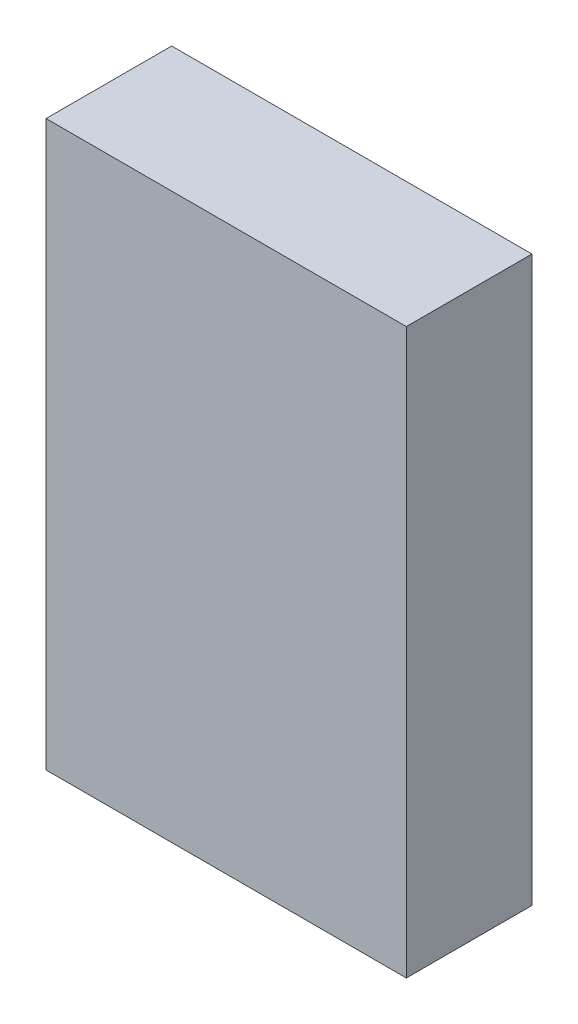
ISO-10303-21;
HEADER;
FILE_DESCRIPTION(('STEP AP214'),'2;1');
FILE_NAME('part.step','',(''),(''),'','','');
FILE_SCHEMA(('AUTOMOTIVE_DESIGN { 1 0 10303 214 1 1 1 1 }'));
ENDSEC;
DATA;
#1=APPLICATION_CONTEXT('core data for automotive mechanical design processes');
#2=APPLICATION_PROTOCOL_DEFINITION('international standard','automotive_design',2000,#1);
#3=PRODUCT_CONTEXT('',#1,'mechanical');
#4=PRODUCT('Part','Part','',(#3));
#5=PRODUCT_RELATED_PRODUCT_CATEGORY('part','',(#4));
#6=PRODUCT_DEFINITION_FORMATION('','',#4);
#7=PRODUCT_DEFINITION_CONTEXT('part definition',#1,'design');
#8=PRODUCT_DEFINITION('design','',#6,#7);
#9=PRODUCT_DEFINITION_SHAPE('','',#8);
#10=(LENGTH_UNIT() NAMED_UNIT(*) SI_UNIT(.MILLI.,.METRE.));
#11=(NAMED_UNIT(*) PLANE_ANGLE_UNIT() SI_UNIT($,.RADIAN.));
#12=(NAMED_UNIT(*) SI_UNIT($,.STERADIAN.) SOLID_ANGLE_UNIT());
#13=UNCERTAINTY_MEASURE_WITH_UNIT(LENGTH_MEASURE(1.E-05),#10,'distance_accuracy_value','');
#14=(GEOMETRIC_REPRESENTATION_CONTEXT(3) GLOBAL_UNCERTAINTY_ASSIGNED_CONTEXT((#13)) GLOBAL_UNIT_ASSIGNED_CONTEXT((#10,
#11,#12)) REPRESENTATION_CONTEXT('',''));
#15=CARTESIAN_POINT('',(0.,0.,0.));
#16=DIRECTION('',(0.,0.,1.));
#17=DIRECTION('',(1.,0.,0.));
#18=AXIS2_PLACEMENT_3D('',#15,#16,#17);
#19=CARTESIAN_POINT('',(3.80000002,5.9500008,2.64999978));
#20=DIRECTION('',(0.,0.,-1.));
#21=DIRECTION('',(-1.,0.,0.));
#22=AXIS2_PLACEMENT_3D('',#19,#20,#21);
#23=PLANE('',#22);
#24=DIRECTION('',(0.,1.,0.));
#25=VECTOR('',#24,1.);
#26=CARTESIAN_POINT('',(-3.80000002,5.9500008,2.64999978));
#27=LINE('',#26,#25);
#28=CARTESIAN_POINT('',(-3.80000002,5.9500008,2.64999978));
#29=VERTEX_POINT('',#28);
#30=CARTESIAN_POINT('',(-3.80000002,-5.9500008,2.64999978));
#31=VERTEX_POINT('',#30);
#32=EDGE_CURVE('E55',#29,#31,#27,.F.);
#33=ORIENTED_EDGE('',*,*,#32,.T.);
#34=DIRECTION('',(1.,0.,0.));
#35=VECTOR('',#34,1.);
#36=CARTESIAN_POINT('',(-3.80000002,-5.9500008,2.64999978));
#37=LINE('',#36,#35);
#38=CARTESIAN_POINT('',(3.80000002,-5.9500008,2.64999978));
#39=VERTEX_POINT('',#38);
#40=EDGE_CURVE('E57',#31,#39,#37,.T.);
#41=ORIENTED_EDGE('',*,*,#40,.T.);
#42=DIRECTION('',(0.,1.,0.));
#43=VECTOR('',#42,1.);
#44=CARTESIAN_POINT('',(3.80000002,-5.9500008,2.64999978));
#45=LINE('',#44,#43);
#46=CARTESIAN_POINT('',(3.80000002,5.9500008,2.64999978));
#47=VERTEX_POINT('',#46);
#48=EDGE_CURVE('E20',#39,#47,#45,.T.);
#49=ORIENTED_EDGE('',*,*,#48,.T.);
#50=DIRECTION('',(1.,0.,0.));
#51=VECTOR('',#50,1.);
#52=CARTESIAN_POINT('',(3.80000002,5.9500008,2.64999978));
#53=LINE('',#52,#51);
#54=EDGE_CURVE('E80',#47,#29,#53,.F.);
#55=ORIENTED_EDGE('',*,*,#54,.T.);
#56=EDGE_LOOP('',(#33,#41,#49,#55));
#57=FACE_BOUND('',#56,.T.);
#58=ADVANCED_FACE('F17',(#57),#23,.F.);
#59=CARTESIAN_POINT('',(3.80000002,-5.9500008,0.));
#60=DIRECTION('',(-1.,0.,0.));
#61=DIRECTION('',(0.,0.,1.));
#62=AXIS2_PLACEMENT_3D('',#59,#60,#61);
#63=PLANE('',#62);
#64=DIRECTION('',(0.,0.,-1.));
#65=VECTOR('',#64,1.);
#66=CARTESIAN_POINT('',(3.80000002,5.9500008,0.));
#67=LINE('',#66,#65);
#68=CARTESIAN_POINT('',(3.80000002,5.9500008,0.));
#69=VERTEX_POINT('',#68);
#70=EDGE_CURVE('E68',#69,#47,#67,.F.);
#71=ORIENTED_EDGE('',*,*,#70,.T.);
#72=ORIENTED_EDGE('',*,*,#48,.F.);
#73=DIRECTION('',(0.,0.,1.));
#74=VECTOR('',#73,1.);
#75=CARTESIAN_POINT('',(3.80000002,-5.9500008,0.));
#76=LINE('',#75,#74);
#77=CARTESIAN_POINT('',(3.80000002,-5.9500008,0.));
#78=VERTEX_POINT('',#77);
#79=EDGE_CURVE('E63',#39,#78,#76,.F.);
#80=ORIENTED_EDGE('',*,*,#79,.T.);
#81=DIRECTION('',(0.,1.,0.));
#82=VECTOR('',#81,1.);
#83=CARTESIAN_POINT('',(3.80000002,5.9500008,0.));
#84=LINE('',#83,#82);
#85=EDGE_CURVE('E83',#69,#78,#84,.F.);
#86=ORIENTED_EDGE('',*,*,#85,.F.);
#87=EDGE_LOOP('',(#71,#72,#80,#86));
#88=FACE_BOUND('',#87,.T.);
#89=ADVANCED_FACE('F65',(#88),#63,.F.);
#90=CARTESIAN_POINT('',(-3.80000002,-5.9500008,0.));
#91=DIRECTION('',(0.,1.,0.));
#92=DIRECTION('',(0.,0.,1.));
#93=AXIS2_PLACEMENT_3D('',#90,#91,#92);
#94=PLANE('',#93);
#95=ORIENTED_EDGE('',*,*,#79,.F.);
#96=ORIENTED_EDGE('',*,*,#40,.F.);
#97=DIRECTION('',(0.,0.,-1.));
#98=VECTOR('',#97,1.);
#99=CARTESIAN_POINT('',(-3.80000002,-5.9500008,0.));
#100=LINE('',#99,#98);
#101=CARTESIAN_POINT('',(-3.80000002,-5.9500008,0.));
#102=VERTEX_POINT('',#101);
#103=EDGE_CURVE('E75',#31,#102,#100,.T.);
#104=ORIENTED_EDGE('',*,*,#103,.T.);
#105=DIRECTION('',(-1.,0.,0.));
#106=VECTOR('',#105,1.);
#107=CARTESIAN_POINT('',(3.80000002,-5.9500008,0.));
#108=LINE('',#107,#106);
#109=EDGE_CURVE('E72',#78,#102,#108,.T.);
#110=ORIENTED_EDGE('',*,*,#109,.F.);
#111=EDGE_LOOP('',(#95,#96,#104,#110));
#112=FACE_BOUND('',#111,.T.);
#113=ADVANCED_FACE('F70',(#112),#94,.F.);
#114=CARTESIAN_POINT('',(-3.80000002,5.9500008,0.));
#115=DIRECTION('',(1.,0.,0.));
#116=DIRECTION('',(0.,0.,-1.));
#117=AXIS2_PLACEMENT_3D('',#114,#115,#116);
#118=PLANE('',#117);
#119=ORIENTED_EDGE('',*,*,#103,.F.);
#120=ORIENTED_EDGE('',*,*,#32,.F.);
#121=DIRECTION('',(0.,0.,-1.));
#122=VECTOR('',#121,1.);
#123=CARTESIAN_POINT('',(-3.80000002,5.9500008,0.));
#124=LINE('',#123,#122);
#125=CARTESIAN_POINT('',(-3.80000002,5.9500008,0.));
#126=VERTEX_POINT('',#125);
#127=EDGE_CURVE('E35',#29,#126,#124,.T.);
#128=ORIENTED_EDGE('',*,*,#127,.T.);
#129=DIRECTION('',(0.,1.,0.));
#130=VECTOR('',#129,1.);
#131=CARTESIAN_POINT('',(-3.80000002,5.9500008,0.));
#132=LINE('',#131,#130);
#133=EDGE_CURVE('E26',#102,#126,#132,.T.);
#134=ORIENTED_EDGE('',*,*,#133,.F.);
#135=EDGE_LOOP('',(#119,#120,#128,#134));
#136=FACE_BOUND('',#135,.T.);
#137=ADVANCED_FACE('F89',(#136),#118,.F.);
#138=CARTESIAN_POINT('',(3.80000002,5.9500008,0.));
#139=DIRECTION('',(0.,-1.,0.));
#140=DIRECTION('',(0.,0.,-1.));
#141=AXIS2_PLACEMENT_3D('',#138,#139,#140);
#142=PLANE('',#141);
#143=ORIENTED_EDGE('',*,*,#127,.F.);
#144=ORIENTED_EDGE('',*,*,#54,.F.);
#145=ORIENTED_EDGE('',*,*,#70,.F.);
#146=DIRECTION('',(-1.,0.,0.));
#147=VECTOR('',#146,1.);
#148=CARTESIAN_POINT('',(3.80000002,5.9500008,0.));
#149=LINE('',#148,#147);
#150=EDGE_CURVE('E11',#126,#69,#149,.F.);
#151=ORIENTED_EDGE('',*,*,#150,.F.);
#152=EDGE_LOOP('',(#143,#144,#145,#151));
#153=FACE_BOUND('',#152,.T.);
#154=ADVANCED_FACE('F91',(#153),#142,.F.);
#155=CARTESIAN_POINT('',(3.80000002,5.9500008,0.));
#156=DIRECTION('',(0.,0.,-1.));
#157=DIRECTION('',(-1.,0.,0.));
#158=AXIS2_PLACEMENT_3D('',#155,#156,#157);
#159=PLANE('',#158);
#160=ORIENTED_EDGE('',*,*,#133,.T.);
#161=ORIENTED_EDGE('',*,*,#150,.T.);
#162=ORIENTED_EDGE('',*,*,#85,.T.);
#163=ORIENTED_EDGE('',*,*,#109,.T.);
#164=EDGE_LOOP('',(#160,#161,#162,#163));
#165=FACE_BOUND('',#164,.T.);
#166=ADVANCED_FACE('F88',(#165),#159,.T.);
#167=CLOSED_SHELL('',(#58,#89,#113,#137,#154,#166));
#168=MANIFOLD_SOLID_BREP('B1',#167);
#169=ADVANCED_BREP_SHAPE_REPRESENTATION('',(#18,#168),#14);
#170=SHAPE_DEFINITION_REPRESENTATION(#9,#169);
ENDSEC;
END-ISO-10303-21;
